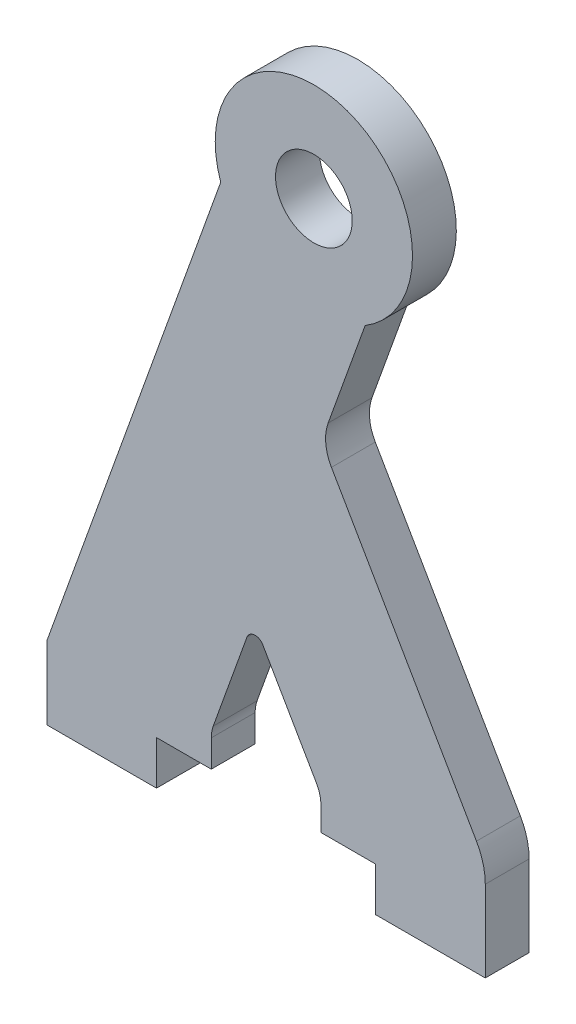
ISO-10303-21;
HEADER;
FILE_DESCRIPTION(('STEP AP214'),'2;1');
FILE_NAME('part.step','',(''),(''),'','','');
FILE_SCHEMA(('AUTOMOTIVE_DESIGN { 1 0 10303 214 1 1 1 1 }'));
ENDSEC;
DATA;
#1=APPLICATION_CONTEXT('core data for automotive mechanical design processes');
#2=APPLICATION_PROTOCOL_DEFINITION('international standard','automotive_design',2000,#1);
#3=PRODUCT_CONTEXT('',#1,'mechanical');
#4=PRODUCT('Part','Part','',(#3));
#5=PRODUCT_RELATED_PRODUCT_CATEGORY('part','',(#4));
#6=PRODUCT_DEFINITION_FORMATION('','',#4);
#7=PRODUCT_DEFINITION_CONTEXT('part definition',#1,'design');
#8=PRODUCT_DEFINITION('design','',#6,#7);
#9=PRODUCT_DEFINITION_SHAPE('','',#8);
#10=(LENGTH_UNIT() NAMED_UNIT(*) SI_UNIT(.MILLI.,.METRE.));
#11=(NAMED_UNIT(*) PLANE_ANGLE_UNIT() SI_UNIT($,.RADIAN.));
#12=(NAMED_UNIT(*) SI_UNIT($,.STERADIAN.) SOLID_ANGLE_UNIT());
#13=UNCERTAINTY_MEASURE_WITH_UNIT(LENGTH_MEASURE(1.E-05),#10,'distance_accuracy_value','');
#14=(GEOMETRIC_REPRESENTATION_CONTEXT(3) GLOBAL_UNCERTAINTY_ASSIGNED_CONTEXT((#13)) GLOBAL_UNIT_ASSIGNED_CONTEXT((#10,
#11,#12)) REPRESENTATION_CONTEXT('',''));
#15=CARTESIAN_POINT('',(0.,0.,0.));
#16=DIRECTION('',(0.,0.,1.));
#17=DIRECTION('',(1.,0.,0.));
#18=AXIS2_PLACEMENT_3D('',#15,#16,#17);
#19=CARTESIAN_POINT('',(14.7135565890345,17.6660075223633,2.));
#20=DIRECTION('',(0.,0.,1.));
#21=DIRECTION('',(1.,0.,0.));
#22=AXIS2_PLACEMENT_3D('',#19,#20,#21);
#23=PLANE('',#22);
#24=CARTESIAN_POINT('',(14.7135565890345,17.6660075223633,2.));
#25=DIRECTION('',(0.,0.,-1.));
#26=DIRECTION('',(1.,0.,0.));
#27=AXIS2_PLACEMENT_3D('',#24,#25,#26);
#28=CIRCLE('',#27,2.);
#29=CARTESIAN_POINT('',(12.9815057814656,16.6660075223632,2.));
#30=VERTEX_POINT('',#29);
#31=CARTESIAN_POINT('',(12.8313029584719,18.342114962223,2.));
#32=VERTEX_POINT('',#31);
#33=EDGE_CURVE('E253',#30,#32,#28,.T.);
#34=ORIENTED_EDGE('',*,*,#33,.T.);
#35=DIRECTION('',(0.338053719929887,0.941126815281323,0.));
#36=VECTOR('',#35,1.);
#37=CARTESIAN_POINT('',(14.5177835424136,23.0372033680777,2.));
#38=LINE('',#37,#36);
#39=CARTESIAN_POINT('',(14.5177835424136,23.0372033680777,2.));
#40=VERTEX_POINT('',#39);
#41=EDGE_CURVE('E136',#32,#40,#38,.T.);
#42=ORIENTED_EDGE('',*,*,#41,.T.);
#43=CARTESIAN_POINT('',(12.18,26.8823,2.));
#44=DIRECTION('',(0.,0.,1.));
#45=DIRECTION('',(1.,0.,0.));
#46=AXIS2_PLACEMENT_3D('',#43,#44,#45);
#47=CIRCLE('',#46,4.5);
#48=CARTESIAN_POINT('',(7.92989583544432,25.4035794075869,2.));
#49=VERTEX_POINT('',#48);
#50=EDGE_CURVE('E307',#40,#49,#47,.T.);
#51=ORIENTED_EDGE('',*,*,#50,.T.);
#52=DIRECTION('',(-0.338053719929887,-0.941126815281323,0.));
#53=VECTOR('',#52,1.);
#54=CARTESIAN_POINT('',(7.92989583544432,25.4035794075869,2.));
#55=LINE('',#54,#53);
#56=CARTESIAN_POINT('',(0.,3.32709518882962,2.));
#57=VERTEX_POINT('',#56);
#58=EDGE_CURVE('E326',#49,#57,#55,.T.);
#59=ORIENTED_EDGE('',*,*,#58,.T.);
#60=DIRECTION('',(0.,-1.,0.));
#61=VECTOR('',#60,1.);
#62=CARTESIAN_POINT('',(0.,0.,2.));
#63=LINE('',#62,#61);
#64=CARTESIAN_POINT('',(0.,0.,2.));
#65=VERTEX_POINT('',#64);
#66=EDGE_CURVE('E323',#57,#65,#63,.T.);
#67=ORIENTED_EDGE('',*,*,#66,.T.);
#68=DIRECTION('',(1.,0.,0.));
#69=VECTOR('',#68,1.);
#70=CARTESIAN_POINT('',(0.,0.,2.));
#71=LINE('',#70,#69);
#72=CARTESIAN_POINT('',(5.,0.,2.));
#73=VERTEX_POINT('',#72);
#74=EDGE_CURVE('E325',#65,#73,#71,.T.);
#75=ORIENTED_EDGE('',*,*,#74,.T.);
#76=DIRECTION('',(0.,1.,0.));
#77=VECTOR('',#76,1.);
#78=CARTESIAN_POINT('',(5.,0.,2.));
#79=LINE('',#78,#77);
#80=CARTESIAN_POINT('',(5.,2.,2.));
#81=VERTEX_POINT('',#80);
#82=EDGE_CURVE('E328',#73,#81,#79,.T.);
#83=ORIENTED_EDGE('',*,*,#82,.T.);
#84=DIRECTION('',(1.,0.,0.));
#85=VECTOR('',#84,1.);
#86=CARTESIAN_POINT('',(5.,2.,2.));
#87=LINE('',#86,#85);
#88=CARTESIAN_POINT('',(7.5,2.,2.));
#89=VERTEX_POINT('',#88);
#90=EDGE_CURVE('E334',#81,#89,#87,.T.);
#91=ORIENTED_EDGE('',*,*,#90,.T.);
#92=DIRECTION('',(0.,1.,0.));
#93=VECTOR('',#92,1.);
#94=CARTESIAN_POINT('',(7.5,2.,2.));
#95=LINE('',#94,#93);
#96=CARTESIAN_POINT('',(7.5,3.23876998869785,2.));
#97=VERTEX_POINT('',#96);
#98=EDGE_CURVE('E336',#89,#97,#95,.T.);
#99=ORIENTED_EDGE('',*,*,#98,.T.);
#100=CARTESIAN_POINT('',(9.,3.23876998869786,2.));
#101=DIRECTION('',(0.,0.,-1.));
#102=DIRECTION('',(-1.,0.,0.));
#103=AXIS2_PLACEMENT_3D('',#100,#101,#102);
#104=CIRCLE('',#103,1.5);
#105=CARTESIAN_POINT('',(7.58830977707802,3.74585056859269,2.));
#106=VERTEX_POINT('',#105);
#107=EDGE_CURVE('E338',#97,#106,#104,.T.);
#108=ORIENTED_EDGE('',*,*,#107,.T.);
#109=DIRECTION('',(0.338053719929886,0.941126815281323,0.));
#110=VECTOR('',#109,1.);
#111=CARTESIAN_POINT('',(9.12609212365485,8.02696956568541,2.));
#112=LINE('',#111,#110);
#113=CARTESIAN_POINT('',(9.12609212365485,8.02696956568541,2.));
#114=VERTEX_POINT('',#113);
#115=EDGE_CURVE('E340',#106,#114,#112,.T.);
#116=ORIENTED_EDGE('',*,*,#115,.T.);
#117=CARTESIAN_POINT('',(9.50254284976738,7.89174807771346,2.));
#118=DIRECTION('',(0.,0.,-1.));
#119=DIRECTION('',(1.,0.,0.));
#120=AXIS2_PLACEMENT_3D('',#117,#118,#119);
#121=CIRCLE('',#120,0.400000000000002);
#122=CARTESIAN_POINT('',(9.84895301128116,8.09174807771346,2.));
#123=VERTEX_POINT('',#122);
#124=EDGE_CURVE('E342',#114,#123,#121,.T.);
#125=ORIENTED_EDGE('',*,*,#124,.T.);
#126=DIRECTION('',(0.500000000000004,-0.866025403784436,0.));
#127=VECTOR('',#126,1.);
#128=CARTESIAN_POINT('',(12.2990381056767,3.84807621135332,2.));
#129=LINE('',#128,#127);
#130=CARTESIAN_POINT('',(12.2990381056767,3.84807621135332,2.));
#131=VERTEX_POINT('',#130);
#132=EDGE_CURVE('E344',#123,#131,#129,.T.);
#133=ORIENTED_EDGE('',*,*,#132,.T.);
#134=CARTESIAN_POINT('',(11.,3.09807621135331,2.));
#135=DIRECTION('',(0.,0.,-1.));
#136=DIRECTION('',(-1.,0.,0.));
#137=AXIS2_PLACEMENT_3D('',#134,#135,#136);
#138=CIRCLE('',#137,1.5);
#139=CARTESIAN_POINT('',(12.5,3.09807621135331,2.));
#140=VERTEX_POINT('',#139);
#141=EDGE_CURVE('E346',#131,#140,#138,.T.);
#142=ORIENTED_EDGE('',*,*,#141,.T.);
#143=DIRECTION('',(0.,-1.,0.));
#144=VECTOR('',#143,1.);
#145=CARTESIAN_POINT('',(12.5,3.09807621135331,2.));
#146=LINE('',#145,#144);
#147=CARTESIAN_POINT('',(12.5,2.,2.));
#148=VERTEX_POINT('',#147);
#149=EDGE_CURVE('E348',#140,#148,#146,.T.);
#150=ORIENTED_EDGE('',*,*,#149,.T.);
#151=DIRECTION('',(1.,0.,0.));
#152=VECTOR('',#151,1.);
#153=CARTESIAN_POINT('',(12.5,2.,2.));
#154=LINE('',#153,#152);
#155=CARTESIAN_POINT('',(15.,2.,2.));
#156=VERTEX_POINT('',#155);
#157=EDGE_CURVE('E350',#148,#156,#154,.T.);
#158=ORIENTED_EDGE('',*,*,#157,.T.);
#159=DIRECTION('',(0.,-1.,0.));
#160=VECTOR('',#159,1.);
#161=CARTESIAN_POINT('',(15.,2.,2.));
#162=LINE('',#161,#160);
#163=CARTESIAN_POINT('',(15.,0.,2.));
#164=VERTEX_POINT('',#163);
#165=EDGE_CURVE('E352',#156,#164,#162,.T.);
#166=ORIENTED_EDGE('',*,*,#165,.T.);
#167=DIRECTION('',(1.,0.,0.));
#168=VECTOR('',#167,1.);
#169=CARTESIAN_POINT('',(15.,0.,2.));
#170=LINE('',#169,#168);
#171=CARTESIAN_POINT('',(20.,0.,2.));
#172=VERTEX_POINT('',#171);
#173=EDGE_CURVE('E194',#164,#172,#170,.T.);
#174=ORIENTED_EDGE('',*,*,#173,.T.);
#175=DIRECTION('',(0.,1.,0.));
#176=VECTOR('',#175,1.);
#177=CARTESIAN_POINT('',(20.,0.,2.));
#178=LINE('',#177,#176);
#179=CARTESIAN_POINT('',(20.,3.70577136594008,2.));
#180=VERTEX_POINT('',#179);
#181=EDGE_CURVE('E188',#172,#180,#178,.T.);
#182=ORIENTED_EDGE('',*,*,#181,.T.);
#183=CARTESIAN_POINT('',(17.,3.70577136594007,2.));
#184=DIRECTION('',(0.,0.,1.));
#185=DIRECTION('',(1.,0.,0.));
#186=AXIS2_PLACEMENT_3D('',#183,#184,#185);
#187=CIRCLE('',#186,3.);
#188=CARTESIAN_POINT('',(19.5980762113533,5.20577136594009,2.));
#189=VERTEX_POINT('',#188);
#190=EDGE_CURVE('E192',#180,#189,#187,.T.);
#191=ORIENTED_EDGE('',*,*,#190,.T.);
#192=DIRECTION('',(-0.500000000000004,0.866025403784436,0.));
#193=VECTOR('',#192,1.);
#194=CARTESIAN_POINT('',(12.9815057814656,16.6660075223632,2.));
#195=LINE('',#194,#193);
#196=EDGE_CURVE('E54',#189,#30,#195,.T.);
#197=ORIENTED_EDGE('',*,*,#196,.T.);
#198=EDGE_LOOP('',(#34,#42,#51,#59,#67,#75,#83,#91,#99,#108,#116,#125,#133,#142,#150,#158,#166,
#174,#182,#191,#197));
#199=FACE_BOUND('',#198,.T.);
#200=CARTESIAN_POINT('',(12.18,26.8823,2.));
#201=DIRECTION('',(0.,0.,1.));
#202=DIRECTION('',(1.,0.,0.));
#203=AXIS2_PLACEMENT_3D('',#200,#201,#202);
#204=CIRCLE('',#203,1.75);
#205=CARTESIAN_POINT('',(13.93,26.8823,2.));
#206=VERTEX_POINT('',#205);
#207=EDGE_CURVE('E216',#206,#206,#204,.T.);
#208=ORIENTED_EDGE('',*,*,#207,.F.);
#209=EDGE_LOOP('',(#208));
#210=FACE_BOUND('',#209,.T.);
#211=ADVANCED_FACE('F37',(#199,#210),#23,.T.);
#212=CARTESIAN_POINT('',(14.7135565890345,17.6660075223633,0.));
#213=DIRECTION('',(0.,0.,1.));
#214=DIRECTION('',(1.,0.,0.));
#215=AXIS2_PLACEMENT_3D('',#212,#213,#214);
#216=PLANE('',#215);
#217=CARTESIAN_POINT('',(14.7135565890345,17.6660075223633,0.));
#218=DIRECTION('',(0.,0.,-1.));
#219=DIRECTION('',(1.,0.,0.));
#220=AXIS2_PLACEMENT_3D('',#217,#218,#219);
#221=CIRCLE('',#220,2.);
#222=CARTESIAN_POINT('',(12.9815057814656,16.6660075223632,0.));
#223=VERTEX_POINT('',#222);
#224=CARTESIAN_POINT('',(12.8313029584719,18.342114962223,0.));
#225=VERTEX_POINT('',#224);
#226=EDGE_CURVE('E212',#223,#225,#221,.T.);
#227=ORIENTED_EDGE('',*,*,#226,.F.);
#228=DIRECTION('',(-0.500000000000004,0.866025403784436,0.));
#229=VECTOR('',#228,1.);
#230=CARTESIAN_POINT('',(12.9815057814656,16.6660075223632,0.));
#231=LINE('',#230,#229);
#232=CARTESIAN_POINT('',(19.5980762113533,5.20577136594009,0.));
#233=VERTEX_POINT('',#232);
#234=EDGE_CURVE('E128',#233,#223,#231,.T.);
#235=ORIENTED_EDGE('',*,*,#234,.F.);
#236=CARTESIAN_POINT('',(17.,3.70577136594007,0.));
#237=DIRECTION('',(0.,0.,1.));
#238=DIRECTION('',(1.,0.,0.));
#239=AXIS2_PLACEMENT_3D('',#236,#237,#238);
#240=CIRCLE('',#239,3.);
#241=CARTESIAN_POINT('',(20.,3.70577136594008,0.));
#242=VERTEX_POINT('',#241);
#243=EDGE_CURVE('E122',#242,#233,#240,.T.);
#244=ORIENTED_EDGE('',*,*,#243,.F.);
#245=DIRECTION('',(0.,1.,0.));
#246=VECTOR('',#245,1.);
#247=CARTESIAN_POINT('',(20.,0.,0.));
#248=LINE('',#247,#246);
#249=CARTESIAN_POINT('',(20.,0.,0.));
#250=VERTEX_POINT('',#249);
#251=EDGE_CURVE('E202',#250,#242,#248,.T.);
#252=ORIENTED_EDGE('',*,*,#251,.F.);
#253=DIRECTION('',(1.,0.,0.));
#254=VECTOR('',#253,1.);
#255=CARTESIAN_POINT('',(15.,0.,0.));
#256=LINE('',#255,#254);
#257=CARTESIAN_POINT('',(15.,0.,0.));
#258=VERTEX_POINT('',#257);
#259=EDGE_CURVE('E248',#258,#250,#256,.T.);
#260=ORIENTED_EDGE('',*,*,#259,.F.);
#261=DIRECTION('',(0.,-1.,0.));
#262=VECTOR('',#261,1.);
#263=CARTESIAN_POINT('',(15.,2.,0.));
#264=LINE('',#263,#262);
#265=CARTESIAN_POINT('',(15.,2.,0.));
#266=VERTEX_POINT('',#265);
#267=EDGE_CURVE('E246',#266,#258,#264,.T.);
#268=ORIENTED_EDGE('',*,*,#267,.F.);
#269=DIRECTION('',(1.,0.,0.));
#270=VECTOR('',#269,1.);
#271=CARTESIAN_POINT('',(12.5,2.,0.));
#272=LINE('',#271,#270);
#273=CARTESIAN_POINT('',(12.5,2.,0.));
#274=VERTEX_POINT('',#273);
#275=EDGE_CURVE('E244',#274,#266,#272,.T.);
#276=ORIENTED_EDGE('',*,*,#275,.F.);
#277=DIRECTION('',(0.,-1.,0.));
#278=VECTOR('',#277,1.);
#279=CARTESIAN_POINT('',(12.5,3.09807621135331,0.));
#280=LINE('',#279,#278);
#281=CARTESIAN_POINT('',(12.5,3.09807621135331,0.));
#282=VERTEX_POINT('',#281);
#283=EDGE_CURVE('E242',#282,#274,#280,.T.);
#284=ORIENTED_EDGE('',*,*,#283,.F.);
#285=CARTESIAN_POINT('',(11.,3.09807621135331,0.));
#286=DIRECTION('',(0.,0.,-1.));
#287=DIRECTION('',(-1.,0.,0.));
#288=AXIS2_PLACEMENT_3D('',#285,#286,#287);
#289=CIRCLE('',#288,1.5);
#290=CARTESIAN_POINT('',(12.2990381056767,3.84807621135332,0.));
#291=VERTEX_POINT('',#290);
#292=EDGE_CURVE('E240',#291,#282,#289,.T.);
#293=ORIENTED_EDGE('',*,*,#292,.F.);
#294=DIRECTION('',(0.500000000000004,-0.866025403784436,0.));
#295=VECTOR('',#294,1.);
#296=CARTESIAN_POINT('',(12.2990381056767,3.84807621135332,0.));
#297=LINE('',#296,#295);
#298=CARTESIAN_POINT('',(9.84895301128116,8.09174807771346,0.));
#299=VERTEX_POINT('',#298);
#300=EDGE_CURVE('E238',#299,#291,#297,.T.);
#301=ORIENTED_EDGE('',*,*,#300,.F.);
#302=CARTESIAN_POINT('',(9.50254284976738,7.89174807771346,0.));
#303=DIRECTION('',(0.,0.,-1.));
#304=DIRECTION('',(1.,0.,0.));
#305=AXIS2_PLACEMENT_3D('',#302,#303,#304);
#306=CIRCLE('',#305,0.400000000000002);
#307=CARTESIAN_POINT('',(9.12609212365485,8.02696956568541,0.));
#308=VERTEX_POINT('',#307);
#309=EDGE_CURVE('E236',#308,#299,#306,.T.);
#310=ORIENTED_EDGE('',*,*,#309,.F.);
#311=DIRECTION('',(0.338053719929886,0.941126815281323,0.));
#312=VECTOR('',#311,1.);
#313=CARTESIAN_POINT('',(9.12609212365485,8.02696956568541,0.));
#314=LINE('',#313,#312);
#315=CARTESIAN_POINT('',(7.58830977707802,3.74585056859269,0.));
#316=VERTEX_POINT('',#315);
#317=EDGE_CURVE('E234',#316,#308,#314,.T.);
#318=ORIENTED_EDGE('',*,*,#317,.F.);
#319=CARTESIAN_POINT('',(9.,3.23876998869786,0.));
#320=DIRECTION('',(0.,0.,-1.));
#321=DIRECTION('',(-1.,0.,0.));
#322=AXIS2_PLACEMENT_3D('',#319,#320,#321);
#323=CIRCLE('',#322,1.5);
#324=CARTESIAN_POINT('',(7.5,3.23876998869785,0.));
#325=VERTEX_POINT('',#324);
#326=EDGE_CURVE('E232',#325,#316,#323,.T.);
#327=ORIENTED_EDGE('',*,*,#326,.F.);
#328=DIRECTION('',(0.,1.,0.));
#329=VECTOR('',#328,1.);
#330=CARTESIAN_POINT('',(7.5,2.,0.));
#331=LINE('',#330,#329);
#332=CARTESIAN_POINT('',(7.5,2.,0.));
#333=VERTEX_POINT('',#332);
#334=EDGE_CURVE('E230',#333,#325,#331,.T.);
#335=ORIENTED_EDGE('',*,*,#334,.F.);
#336=DIRECTION('',(1.,0.,0.));
#337=VECTOR('',#336,1.);
#338=CARTESIAN_POINT('',(5.,2.,0.));
#339=LINE('',#338,#337);
#340=CARTESIAN_POINT('',(5.,2.,0.));
#341=VERTEX_POINT('',#340);
#342=EDGE_CURVE('E228',#341,#333,#339,.T.);
#343=ORIENTED_EDGE('',*,*,#342,.F.);
#344=DIRECTION('',(0.,1.,0.));
#345=VECTOR('',#344,1.);
#346=CARTESIAN_POINT('',(5.,0.,0.));
#347=LINE('',#346,#345);
#348=CARTESIAN_POINT('',(5.,0.,0.));
#349=VERTEX_POINT('',#348);
#350=EDGE_CURVE('E226',#349,#341,#347,.T.);
#351=ORIENTED_EDGE('',*,*,#350,.F.);
#352=DIRECTION('',(1.,0.,0.));
#353=VECTOR('',#352,1.);
#354=CARTESIAN_POINT('',(0.,0.,0.));
#355=LINE('',#354,#353);
#356=CARTESIAN_POINT('',(0.,0.,0.));
#357=VERTEX_POINT('',#356);
#358=EDGE_CURVE('E224',#357,#349,#355,.T.);
#359=ORIENTED_EDGE('',*,*,#358,.F.);
#360=DIRECTION('',(0.,-1.,0.));
#361=VECTOR('',#360,1.);
#362=CARTESIAN_POINT('',(0.,0.,0.));
#363=LINE('',#362,#361);
#364=CARTESIAN_POINT('',(0.,3.32709518882962,0.));
#365=VERTEX_POINT('',#364);
#366=EDGE_CURVE('E222',#365,#357,#363,.T.);
#367=ORIENTED_EDGE('',*,*,#366,.F.);
#368=DIRECTION('',(-0.338053719929887,-0.941126815281323,0.));
#369=VECTOR('',#368,1.);
#370=CARTESIAN_POINT('',(7.92989583544432,25.4035794075869,0.));
#371=LINE('',#370,#369);
#372=CARTESIAN_POINT('',(7.92989583544432,25.4035794075869,0.));
#373=VERTEX_POINT('',#372);
#374=EDGE_CURVE('E220',#373,#365,#371,.T.);
#375=ORIENTED_EDGE('',*,*,#374,.F.);
#376=CARTESIAN_POINT('',(12.18,26.8823,0.));
#377=DIRECTION('',(0.,0.,1.));
#378=DIRECTION('',(1.,0.,0.));
#379=AXIS2_PLACEMENT_3D('',#376,#377,#378);
#380=CIRCLE('',#379,4.5);
#381=CARTESIAN_POINT('',(14.5177835424136,23.0372033680777,0.));
#382=VERTEX_POINT('',#381);
#383=EDGE_CURVE('E218',#382,#373,#380,.T.);
#384=ORIENTED_EDGE('',*,*,#383,.F.);
#385=DIRECTION('',(0.338053719929887,0.941126815281323,0.));
#386=VECTOR('',#385,1.);
#387=CARTESIAN_POINT('',(14.5177835424136,23.0372033680777,0.));
#388=LINE('',#387,#386);
#389=EDGE_CURVE('E215',#225,#382,#388,.T.);
#390=ORIENTED_EDGE('',*,*,#389,.F.);
#391=EDGE_LOOP('',(#227,#235,#244,#252,#260,#268,#276,#284,#293,#301,#310,#318,#327,#335,#343,
#351,#359,#367,#375,#384,#390));
#392=FACE_BOUND('',#391,.T.);
#393=CARTESIAN_POINT('',(12.18,26.8823,0.));
#394=DIRECTION('',(0.,0.,1.));
#395=DIRECTION('',(1.,0.,0.));
#396=AXIS2_PLACEMENT_3D('',#393,#394,#395);
#397=CIRCLE('',#396,1.75);
#398=CARTESIAN_POINT('',(13.93,26.8823,0.));
#399=VERTEX_POINT('',#398);
#400=EDGE_CURVE('E568',#399,#399,#397,.T.);
#401=ORIENTED_EDGE('',*,*,#400,.T.);
#402=EDGE_LOOP('',(#401));
#403=FACE_BOUND('',#402,.T.);
#404=ADVANCED_FACE('F311',(#392,#403),#216,.F.);
#405=CARTESIAN_POINT('',(14.7135565890345,17.6660075223633,2.));
#406=DIRECTION('',(0.,0.,-1.));
#407=DIRECTION('',(-1.,0.,0.));
#408=AXIS2_PLACEMENT_3D('',#405,#406,#407);
#409=CYLINDRICAL_SURFACE('',#408,2.);
#410=ORIENTED_EDGE('',*,*,#226,.T.);
#411=DIRECTION('',(0.,0.,-1.));
#412=VECTOR('',#411,1.);
#413=CARTESIAN_POINT('',(12.8313029584719,18.342114962223,2.));
#414=LINE('',#413,#412);
#415=EDGE_CURVE('E11',#32,#225,#414,.T.);
#416=ORIENTED_EDGE('',*,*,#415,.F.);
#417=ORIENTED_EDGE('',*,*,#33,.F.);
#418=DIRECTION('',(0.,0.,-1.));
#419=VECTOR('',#418,1.);
#420=CARTESIAN_POINT('',(12.9815057814656,16.6660075223632,2.));
#421=LINE('',#420,#419);
#422=EDGE_CURVE('E208',#30,#223,#421,.T.);
#423=ORIENTED_EDGE('',*,*,#422,.T.);
#424=EDGE_LOOP('',(#410,#416,#417,#423));
#425=FACE_BOUND('',#424,.T.);
#426=ADVANCED_FACE('F39',(#425),#409,.F.);
#427=CARTESIAN_POINT('',(14.5177835424136,23.0372033680777,2.));
#428=DIRECTION('',(-0.941126815281323,0.338053719929887,0.));
#429=DIRECTION('',(-0.338053719929887,-0.941126815281323,0.));
#430=AXIS2_PLACEMENT_3D('',#427,#428,#429);
#431=PLANE('',#430);
#432=ORIENTED_EDGE('',*,*,#389,.T.);
#433=DIRECTION('',(0.,0.,-1.));
#434=VECTOR('',#433,1.);
#435=CARTESIAN_POINT('',(14.5177835424136,23.0372033680777,2.));
#436=LINE('',#435,#434);
#437=EDGE_CURVE('E46',#40,#382,#436,.T.);
#438=ORIENTED_EDGE('',*,*,#437,.F.);
#439=ORIENTED_EDGE('',*,*,#41,.F.);
#440=ORIENTED_EDGE('',*,*,#415,.T.);
#441=EDGE_LOOP('',(#432,#438,#439,#440));
#442=FACE_BOUND('',#441,.T.);
#443=ADVANCED_FACE('F386',(#442),#431,.F.);
#444=CARTESIAN_POINT('',(12.18,26.8823,2.));
#445=DIRECTION('',(0.,0.,-1.));
#446=DIRECTION('',(-1.,0.,0.));
#447=AXIS2_PLACEMENT_3D('',#444,#445,#446);
#448=CYLINDRICAL_SURFACE('',#447,4.5);
#449=ORIENTED_EDGE('',*,*,#383,.T.);
#450=DIRECTION('',(0.,0.,-1.));
#451=VECTOR('',#450,1.);
#452=CARTESIAN_POINT('',(7.92989583544432,25.4035794075869,2.));
#453=LINE('',#452,#451);
#454=EDGE_CURVE('E299',#49,#373,#453,.T.);
#455=ORIENTED_EDGE('',*,*,#454,.F.);
#456=ORIENTED_EDGE('',*,*,#50,.F.);
#457=ORIENTED_EDGE('',*,*,#437,.T.);
#458=EDGE_LOOP('',(#449,#455,#456,#457));
#459=FACE_BOUND('',#458,.T.);
#460=ADVANCED_FACE('F305',(#459),#448,.T.);
#461=CARTESIAN_POINT('',(7.92989583544432,25.4035794075869,2.));
#462=DIRECTION('',(0.941126815281323,-0.338053719929887,0.));
#463=DIRECTION('',(0.338053719929887,0.941126815281323,0.));
#464=AXIS2_PLACEMENT_3D('',#461,#462,#463);
#465=PLANE('',#464);
#466=ORIENTED_EDGE('',*,*,#374,.T.);
#467=DIRECTION('',(0.,0.,-1.));
#468=VECTOR('',#467,1.);
#469=CARTESIAN_POINT('',(0.,3.32709518882962,2.));
#470=LINE('',#469,#468);
#471=EDGE_CURVE('E296',#57,#365,#470,.T.);
#472=ORIENTED_EDGE('',*,*,#471,.F.);
#473=ORIENTED_EDGE('',*,*,#58,.F.);
#474=ORIENTED_EDGE('',*,*,#454,.T.);
#475=EDGE_LOOP('',(#466,#472,#473,#474));
#476=FACE_BOUND('',#475,.T.);
#477=ADVANCED_FACE('F317',(#476),#465,.F.);
#478=CARTESIAN_POINT('',(0.,0.,2.));
#479=DIRECTION('',(1.,0.,0.));
#480=DIRECTION('',(0.,1.,0.));
#481=AXIS2_PLACEMENT_3D('',#478,#479,#480);
#482=PLANE('',#481);
#483=ORIENTED_EDGE('',*,*,#366,.T.);
#484=DIRECTION('',(0.,0.,-1.));
#485=VECTOR('',#484,1.);
#486=CARTESIAN_POINT('',(0.,0.,2.));
#487=LINE('',#486,#485);
#488=EDGE_CURVE('E293',#65,#357,#487,.T.);
#489=ORIENTED_EDGE('',*,*,#488,.F.);
#490=ORIENTED_EDGE('',*,*,#66,.F.);
#491=ORIENTED_EDGE('',*,*,#471,.T.);
#492=EDGE_LOOP('',(#483,#489,#490,#491));
#493=FACE_BOUND('',#492,.T.);
#494=ADVANCED_FACE('F321',(#493),#482,.F.);
#495=CARTESIAN_POINT('',(0.,0.,2.));
#496=DIRECTION('',(0.,1.,0.));
#497=DIRECTION('',(0.,0.,1.));
#498=AXIS2_PLACEMENT_3D('',#495,#496,#497);
#499=PLANE('',#498);
#500=ORIENTED_EDGE('',*,*,#358,.T.);
#501=DIRECTION('',(0.,0.,-1.));
#502=VECTOR('',#501,1.);
#503=CARTESIAN_POINT('',(5.,0.,2.));
#504=LINE('',#503,#502);
#505=EDGE_CURVE('E290',#73,#349,#504,.T.);
#506=ORIENTED_EDGE('',*,*,#505,.F.);
#507=ORIENTED_EDGE('',*,*,#74,.F.);
#508=ORIENTED_EDGE('',*,*,#488,.T.);
#509=EDGE_LOOP('',(#500,#506,#507,#508));
#510=FACE_BOUND('',#509,.T.);
#511=ADVANCED_FACE('F399',(#510),#499,.F.);
#512=CARTESIAN_POINT('',(5.,0.,2.));
#513=DIRECTION('',(-1.,0.,0.));
#514=DIRECTION('',(0.,0.,1.));
#515=AXIS2_PLACEMENT_3D('',#512,#513,#514);
#516=PLANE('',#515);
#517=ORIENTED_EDGE('',*,*,#350,.T.);
#518=DIRECTION('',(0.,0.,-1.));
#519=VECTOR('',#518,1.);
#520=CARTESIAN_POINT('',(5.,2.,2.));
#521=LINE('',#520,#519);
#522=EDGE_CURVE('E287',#81,#341,#521,.T.);
#523=ORIENTED_EDGE('',*,*,#522,.F.);
#524=ORIENTED_EDGE('',*,*,#82,.F.);
#525=ORIENTED_EDGE('',*,*,#505,.T.);
#526=EDGE_LOOP('',(#517,#523,#524,#525));
#527=FACE_BOUND('',#526,.T.);
#528=ADVANCED_FACE('F402',(#527),#516,.F.);
#529=CARTESIAN_POINT('',(5.,2.,2.));
#530=DIRECTION('',(0.,1.,0.));
#531=DIRECTION('',(0.,0.,1.));
#532=AXIS2_PLACEMENT_3D('',#529,#530,#531);
#533=PLANE('',#532);
#534=ORIENTED_EDGE('',*,*,#342,.T.);
#535=DIRECTION('',(0.,0.,-1.));
#536=VECTOR('',#535,1.);
#537=CARTESIAN_POINT('',(7.5,2.,2.));
#538=LINE('',#537,#536);
#539=EDGE_CURVE('E284',#89,#333,#538,.T.);
#540=ORIENTED_EDGE('',*,*,#539,.F.);
#541=ORIENTED_EDGE('',*,*,#90,.F.);
#542=ORIENTED_EDGE('',*,*,#522,.T.);
#543=EDGE_LOOP('',(#534,#540,#541,#542));
#544=FACE_BOUND('',#543,.T.);
#545=ADVANCED_FACE('F406',(#544),#533,.F.);
#546=CARTESIAN_POINT('',(7.5,2.,2.));
#547=DIRECTION('',(-1.,0.,0.));
#548=DIRECTION('',(0.,0.,1.));
#549=AXIS2_PLACEMENT_3D('',#546,#547,#548);
#550=PLANE('',#549);
#551=ORIENTED_EDGE('',*,*,#334,.T.);
#552=DIRECTION('',(0.,0.,-1.));
#553=VECTOR('',#552,1.);
#554=CARTESIAN_POINT('',(7.5,3.23876998869785,2.));
#555=LINE('',#554,#553);
#556=EDGE_CURVE('E281',#97,#325,#555,.T.);
#557=ORIENTED_EDGE('',*,*,#556,.F.);
#558=ORIENTED_EDGE('',*,*,#98,.F.);
#559=ORIENTED_EDGE('',*,*,#539,.T.);
#560=EDGE_LOOP('',(#551,#557,#558,#559));
#561=FACE_BOUND('',#560,.T.);
#562=ADVANCED_FACE('F410',(#561),#550,.F.);
#563=CARTESIAN_POINT('',(9.,3.23876998869786,2.));
#564=DIRECTION('',(0.,0.,-1.));
#565=DIRECTION('',(-1.,0.,0.));
#566=AXIS2_PLACEMENT_3D('',#563,#564,#565);
#567=CYLINDRICAL_SURFACE('',#566,1.5);
#568=ORIENTED_EDGE('',*,*,#326,.T.);
#569=DIRECTION('',(0.,0.,-1.));
#570=VECTOR('',#569,1.);
#571=CARTESIAN_POINT('',(7.58830977707802,3.74585056859269,2.));
#572=LINE('',#571,#570);
#573=EDGE_CURVE('E278',#106,#316,#572,.T.);
#574=ORIENTED_EDGE('',*,*,#573,.F.);
#575=ORIENTED_EDGE('',*,*,#107,.F.);
#576=ORIENTED_EDGE('',*,*,#556,.T.);
#577=EDGE_LOOP('',(#568,#574,#575,#576));
#578=FACE_BOUND('',#577,.T.);
#579=ADVANCED_FACE('F414',(#578),#567,.F.);
#580=CARTESIAN_POINT('',(9.12609212365485,8.02696956568541,2.));
#581=DIRECTION('',(-0.941126815281323,0.338053719929886,0.));
#582=DIRECTION('',(-0.338053719929886,-0.941126815281323,0.));
#583=AXIS2_PLACEMENT_3D('',#580,#581,#582);
#584=PLANE('',#583);
#585=ORIENTED_EDGE('',*,*,#317,.T.);
#586=DIRECTION('',(0.,0.,-1.));
#587=VECTOR('',#586,1.);
#588=CARTESIAN_POINT('',(9.12609212365485,8.02696956568541,2.));
#589=LINE('',#588,#587);
#590=EDGE_CURVE('E275',#114,#308,#589,.T.);
#591=ORIENTED_EDGE('',*,*,#590,.F.);
#592=ORIENTED_EDGE('',*,*,#115,.F.);
#593=ORIENTED_EDGE('',*,*,#573,.T.);
#594=EDGE_LOOP('',(#585,#591,#592,#593));
#595=FACE_BOUND('',#594,.T.);
#596=ADVANCED_FACE('F418',(#595),#584,.F.);
#597=CARTESIAN_POINT('',(9.50254284976738,7.89174807771346,2.));
#598=DIRECTION('',(0.,0.,-1.));
#599=DIRECTION('',(-1.,0.,0.));
#600=AXIS2_PLACEMENT_3D('',#597,#598,#599);
#601=CYLINDRICAL_SURFACE('',#600,0.400000000000002);
#602=ORIENTED_EDGE('',*,*,#309,.T.);
#603=DIRECTION('',(0.,0.,-1.));
#604=VECTOR('',#603,1.);
#605=CARTESIAN_POINT('',(9.84895301128116,8.09174807771346,2.));
#606=LINE('',#605,#604);
#607=EDGE_CURVE('E272',#123,#299,#606,.T.);
#608=ORIENTED_EDGE('',*,*,#607,.F.);
#609=ORIENTED_EDGE('',*,*,#124,.F.);
#610=ORIENTED_EDGE('',*,*,#590,.T.);
#611=EDGE_LOOP('',(#602,#608,#609,#610));
#612=FACE_BOUND('',#611,.T.);
#613=ADVANCED_FACE('F422',(#612),#601,.F.);
#614=CARTESIAN_POINT('',(12.2990381056767,3.84807621135332,2.));
#615=DIRECTION('',(0.866025403784436,0.500000000000004,0.));
#616=DIRECTION('',(-0.500000000000004,0.866025403784436,0.));
#617=AXIS2_PLACEMENT_3D('',#614,#615,#616);
#618=PLANE('',#617);
#619=ORIENTED_EDGE('',*,*,#300,.T.);
#620=DIRECTION('',(0.,0.,-1.));
#621=VECTOR('',#620,1.);
#622=CARTESIAN_POINT('',(12.2990381056767,3.84807621135332,2.));
#623=LINE('',#622,#621);
#624=EDGE_CURVE('E269',#131,#291,#623,.T.);
#625=ORIENTED_EDGE('',*,*,#624,.F.);
#626=ORIENTED_EDGE('',*,*,#132,.F.);
#627=ORIENTED_EDGE('',*,*,#607,.T.);
#628=EDGE_LOOP('',(#619,#625,#626,#627));
#629=FACE_BOUND('',#628,.T.);
#630=ADVANCED_FACE('F426',(#629),#618,.F.);
#631=CARTESIAN_POINT('',(11.,3.09807621135331,2.));
#632=DIRECTION('',(0.,0.,-1.));
#633=DIRECTION('',(-1.,0.,0.));
#634=AXIS2_PLACEMENT_3D('',#631,#632,#633);
#635=CYLINDRICAL_SURFACE('',#634,1.5);
#636=ORIENTED_EDGE('',*,*,#292,.T.);
#637=DIRECTION('',(0.,0.,-1.));
#638=VECTOR('',#637,1.);
#639=CARTESIAN_POINT('',(12.5,3.09807621135331,2.));
#640=LINE('',#639,#638);
#641=EDGE_CURVE('E266',#140,#282,#640,.T.);
#642=ORIENTED_EDGE('',*,*,#641,.F.);
#643=ORIENTED_EDGE('',*,*,#141,.F.);
#644=ORIENTED_EDGE('',*,*,#624,.T.);
#645=EDGE_LOOP('',(#636,#642,#643,#644));
#646=FACE_BOUND('',#645,.T.);
#647=ADVANCED_FACE('F430',(#646),#635,.F.);
#648=CARTESIAN_POINT('',(12.5,3.09807621135331,2.));
#649=DIRECTION('',(1.,0.,0.));
#650=DIRECTION('',(0.,1.,0.));
#651=AXIS2_PLACEMENT_3D('',#648,#649,#650);
#652=PLANE('',#651);
#653=ORIENTED_EDGE('',*,*,#283,.T.);
#654=DIRECTION('',(0.,0.,-1.));
#655=VECTOR('',#654,1.);
#656=CARTESIAN_POINT('',(12.5,2.,2.));
#657=LINE('',#656,#655);
#658=EDGE_CURVE('E263',#148,#274,#657,.T.);
#659=ORIENTED_EDGE('',*,*,#658,.F.);
#660=ORIENTED_EDGE('',*,*,#149,.F.);
#661=ORIENTED_EDGE('',*,*,#641,.T.);
#662=EDGE_LOOP('',(#653,#659,#660,#661));
#663=FACE_BOUND('',#662,.T.);
#664=ADVANCED_FACE('F434',(#663),#652,.F.);
#665=CARTESIAN_POINT('',(12.5,2.,2.));
#666=DIRECTION('',(0.,1.,0.));
#667=DIRECTION('',(0.,0.,1.));
#668=AXIS2_PLACEMENT_3D('',#665,#666,#667);
#669=PLANE('',#668);
#670=ORIENTED_EDGE('',*,*,#275,.T.);
#671=DIRECTION('',(0.,0.,-1.));
#672=VECTOR('',#671,1.);
#673=CARTESIAN_POINT('',(15.,2.,2.));
#674=LINE('',#673,#672);
#675=EDGE_CURVE('E260',#156,#266,#674,.T.);
#676=ORIENTED_EDGE('',*,*,#675,.F.);
#677=ORIENTED_EDGE('',*,*,#157,.F.);
#678=ORIENTED_EDGE('',*,*,#658,.T.);
#679=EDGE_LOOP('',(#670,#676,#677,#678));
#680=FACE_BOUND('',#679,.T.);
#681=ADVANCED_FACE('F438',(#680),#669,.F.);
#682=CARTESIAN_POINT('',(15.,2.,2.));
#683=DIRECTION('',(1.,0.,0.));
#684=DIRECTION('',(0.,0.,-1.));
#685=AXIS2_PLACEMENT_3D('',#682,#683,#684);
#686=PLANE('',#685);
#687=ORIENTED_EDGE('',*,*,#267,.T.);
#688=DIRECTION('',(0.,0.,-1.));
#689=VECTOR('',#688,1.);
#690=CARTESIAN_POINT('',(15.,0.,2.));
#691=LINE('',#690,#689);
#692=EDGE_CURVE('E257',#164,#258,#691,.T.);
#693=ORIENTED_EDGE('',*,*,#692,.F.);
#694=ORIENTED_EDGE('',*,*,#165,.F.);
#695=ORIENTED_EDGE('',*,*,#675,.T.);
#696=EDGE_LOOP('',(#687,#693,#694,#695));
#697=FACE_BOUND('',#696,.T.);
#698=ADVANCED_FACE('F358',(#697),#686,.F.);
#699=CARTESIAN_POINT('',(15.,0.,2.));
#700=DIRECTION('',(0.,1.,0.));
#701=DIRECTION('',(0.,0.,1.));
#702=AXIS2_PLACEMENT_3D('',#699,#700,#701);
#703=PLANE('',#702);
#704=ORIENTED_EDGE('',*,*,#259,.T.);
#705=DIRECTION('',(0.,0.,-1.));
#706=VECTOR('',#705,1.);
#707=CARTESIAN_POINT('',(20.,0.,2.));
#708=LINE('',#707,#706);
#709=EDGE_CURVE('E203',#172,#250,#708,.T.);
#710=ORIENTED_EDGE('',*,*,#709,.F.);
#711=ORIENTED_EDGE('',*,*,#173,.F.);
#712=ORIENTED_EDGE('',*,*,#692,.T.);
#713=EDGE_LOOP('',(#704,#710,#711,#712));
#714=FACE_BOUND('',#713,.T.);
#715=ADVANCED_FACE('F362',(#714),#703,.F.);
#716=CARTESIAN_POINT('',(20.,0.,2.));
#717=DIRECTION('',(-1.,0.,0.));
#718=DIRECTION('',(0.,-1.,0.));
#719=AXIS2_PLACEMENT_3D('',#716,#717,#718);
#720=PLANE('',#719);
#721=ORIENTED_EDGE('',*,*,#251,.T.);
#722=DIRECTION('',(0.,0.,-1.));
#723=VECTOR('',#722,1.);
#724=CARTESIAN_POINT('',(20.,3.70577136594008,2.));
#725=LINE('',#724,#723);
#726=EDGE_CURVE('E199',#180,#242,#725,.T.);
#727=ORIENTED_EDGE('',*,*,#726,.F.);
#728=ORIENTED_EDGE('',*,*,#181,.F.);
#729=ORIENTED_EDGE('',*,*,#709,.T.);
#730=EDGE_LOOP('',(#721,#727,#728,#729));
#731=FACE_BOUND('',#730,.T.);
#732=ADVANCED_FACE('F200',(#731),#720,.F.);
#733=CARTESIAN_POINT('',(17.,3.70577136594007,2.));
#734=DIRECTION('',(0.,0.,-1.));
#735=DIRECTION('',(-1.,0.,0.));
#736=AXIS2_PLACEMENT_3D('',#733,#734,#735);
#737=CYLINDRICAL_SURFACE('',#736,3.);
#738=ORIENTED_EDGE('',*,*,#243,.T.);
#739=DIRECTION('',(0.,0.,-1.));
#740=VECTOR('',#739,1.);
#741=CARTESIAN_POINT('',(19.5980762113533,5.20577136594009,2.));
#742=LINE('',#741,#740);
#743=EDGE_CURVE('E204',#189,#233,#742,.T.);
#744=ORIENTED_EDGE('',*,*,#743,.F.);
#745=ORIENTED_EDGE('',*,*,#190,.F.);
#746=ORIENTED_EDGE('',*,*,#726,.T.);
#747=EDGE_LOOP('',(#738,#744,#745,#746));
#748=FACE_BOUND('',#747,.T.);
#749=ADVANCED_FACE('F206',(#748),#737,.T.);
#750=CARTESIAN_POINT('',(12.9815057814656,16.6660075223632,2.));
#751=DIRECTION('',(-0.866025403784436,-0.500000000000004,0.));
#752=DIRECTION('',(0.500000000000004,-0.866025403784436,0.));
#753=AXIS2_PLACEMENT_3D('',#750,#751,#752);
#754=PLANE('',#753);
#755=ORIENTED_EDGE('',*,*,#234,.T.);
#756=ORIENTED_EDGE('',*,*,#422,.F.);
#757=ORIENTED_EDGE('',*,*,#196,.F.);
#758=ORIENTED_EDGE('',*,*,#743,.T.);
#759=EDGE_LOOP('',(#755,#756,#757,#758));
#760=FACE_BOUND('',#759,.T.);
#761=ADVANCED_FACE('F366',(#760),#754,.F.);
#762=CARTESIAN_POINT('',(12.18,26.8823,2.));
#763=DIRECTION('',(0.,0.,-1.));
#764=DIRECTION('',(-1.,0.,0.));
#765=AXIS2_PLACEMENT_3D('',#762,#763,#764);
#766=CYLINDRICAL_SURFACE('',#765,1.75);
#767=ORIENTED_EDGE('',*,*,#207,.T.);
#768=EDGE_LOOP('',(#767));
#769=FACE_BOUND('',#768,.T.);
#770=ORIENTED_EDGE('',*,*,#400,.F.);
#771=EDGE_LOOP('',(#770));
#772=FACE_BOUND('',#771,.T.);
#773=ADVANCED_FACE('F368',(#769,#772),#766,.F.);
#774=CLOSED_SHELL('',(#211,#404,#426,#443,#460,#477,#494,#511,#528,#545,#562,#579,#596,#613,
#630,#647,#664,#681,#698,#715,#732,#749,#761,#773));
#775=MANIFOLD_SOLID_BREP('B2',#774);
#776=ADVANCED_BREP_SHAPE_REPRESENTATION('',(#18,#775),#14);
#777=SHAPE_DEFINITION_REPRESENTATION(#9,#776);
ENDSEC;
END-ISO-10303-21;
